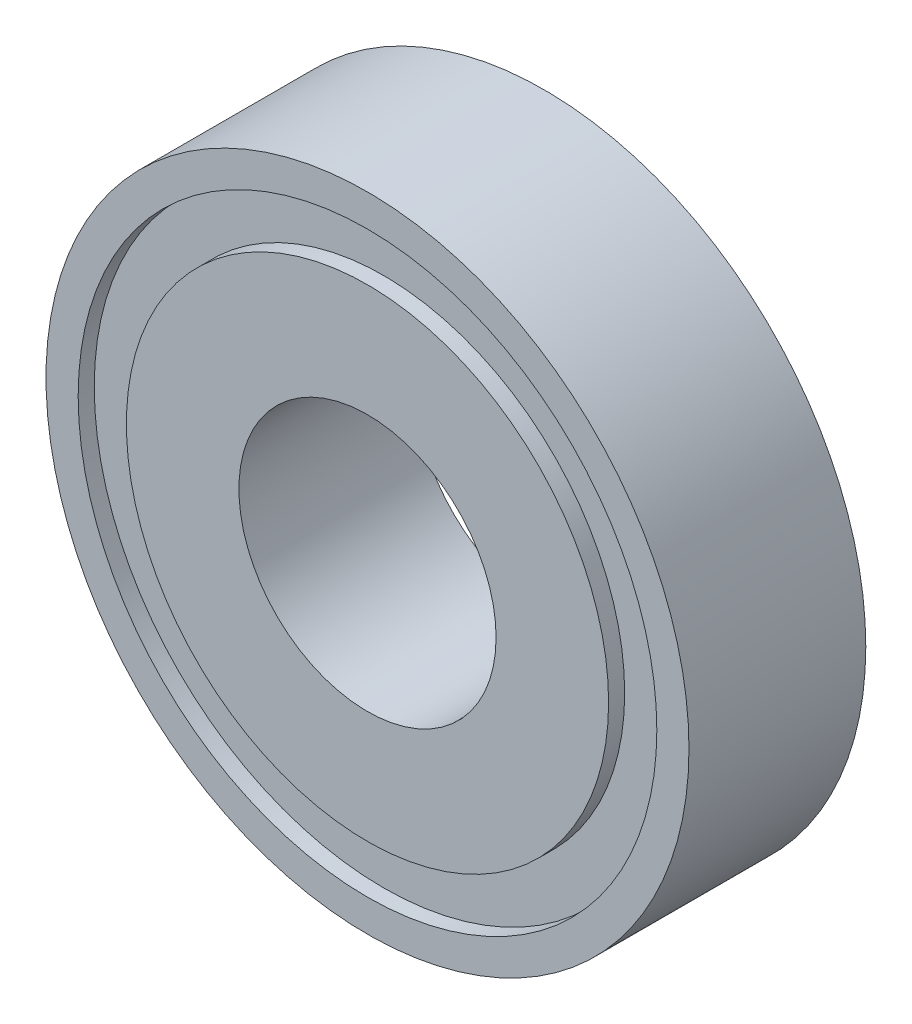
ISO-10303-21;
HEADER;
FILE_DESCRIPTION(('STEP AP214'),'2;1');
FILE_NAME('part.step','',(''),(''),'','','');
FILE_SCHEMA(('AUTOMOTIVE_DESIGN { 1 0 10303 214 1 1 1 1 }'));
ENDSEC;
DATA;
#1=APPLICATION_CONTEXT('core data for automotive mechanical design processes');
#2=APPLICATION_PROTOCOL_DEFINITION('international standard','automotive_design',2000,#1);
#3=PRODUCT_CONTEXT('',#1,'mechanical');
#4=PRODUCT('Part','Part','',(#3));
#5=PRODUCT_RELATED_PRODUCT_CATEGORY('part','',(#4));
#6=PRODUCT_DEFINITION_FORMATION('','',#4);
#7=PRODUCT_DEFINITION_CONTEXT('part definition',#1,'design');
#8=PRODUCT_DEFINITION('design','',#6,#7);
#9=PRODUCT_DEFINITION_SHAPE('','',#8);
#10=(LENGTH_UNIT() NAMED_UNIT(*) SI_UNIT(.MILLI.,.METRE.));
#11=(NAMED_UNIT(*) PLANE_ANGLE_UNIT() SI_UNIT($,.RADIAN.));
#12=(NAMED_UNIT(*) SI_UNIT($,.STERADIAN.) SOLID_ANGLE_UNIT());
#13=UNCERTAINTY_MEASURE_WITH_UNIT(LENGTH_MEASURE(1.E-05),#10,'distance_accuracy_value','');
#14=(GEOMETRIC_REPRESENTATION_CONTEXT(3) GLOBAL_UNCERTAINTY_ASSIGNED_CONTEXT((#13)) GLOBAL_UNIT_ASSIGNED_CONTEXT((#10,
#11,#12)) REPRESENTATION_CONTEXT('',''));
#15=CARTESIAN_POINT('',(0.,0.,0.));
#16=DIRECTION('',(0.,0.,1.));
#17=DIRECTION('',(1.,0.,0.));
#18=AXIS2_PLACEMENT_3D('',#15,#16,#17);
#19=CARTESIAN_POINT('',(0.,0.,11.));
#20=DIRECTION('',(0.,0.,1.));
#21=DIRECTION('',(1.,0.,0.));
#22=AXIS2_PLACEMENT_3D('',#19,#20,#21);
#23=PLANE('',#22);
#24=CARTESIAN_POINT('',(0.,0.,11.));
#25=DIRECTION('',(0.,0.,1.));
#26=DIRECTION('',(1.,0.,0.));
#27=AXIS2_PLACEMENT_3D('',#24,#25,#26);
#28=CIRCLE('',#27,8.);
#29=CARTESIAN_POINT('',(8.,0.,11.));
#30=VERTEX_POINT('',#29);
#31=EDGE_CURVE('E44',#30,#30,#28,.T.);
#32=ORIENTED_EDGE('',*,*,#31,.F.);
#33=EDGE_LOOP('',(#32));
#34=FACE_BOUND('',#33,.T.);
#35=CARTESIAN_POINT('',(0.,0.,11.));
#36=DIRECTION('',(0.,0.,1.));
#37=DIRECTION('',(1.,0.,0.));
#38=AXIS2_PLACEMENT_3D('',#35,#36,#37);
#39=CIRCLE('',#38,15.);
#40=CARTESIAN_POINT('',(15.,0.,11.));
#41=VERTEX_POINT('',#40);
#42=EDGE_CURVE('E58',#41,#41,#39,.T.);
#43=ORIENTED_EDGE('',*,*,#42,.T.);
#44=EDGE_LOOP('',(#43));
#45=FACE_BOUND('',#44,.T.);
#46=ADVANCED_FACE('F33',(#34,#45),#23,.T.);
#47=CARTESIAN_POINT('',(0.,0.,11.));
#48=DIRECTION('',(0.,0.,1.));
#49=DIRECTION('',(1.,0.,0.));
#50=AXIS2_PLACEMENT_3D('',#47,#48,#49);
#51=CIRCLE('',#50,18.);
#52=CARTESIAN_POINT('',(18.,0.,11.));
#53=VERTEX_POINT('',#52);
#54=EDGE_CURVE('E52',#53,#53,#51,.T.);
#55=ORIENTED_EDGE('',*,*,#54,.F.);
#56=EDGE_LOOP('',(#55));
#57=FACE_BOUND('',#56,.T.);
#58=CARTESIAN_POINT('',(0.,0.,11.));
#59=DIRECTION('',(0.,0.,1.));
#60=DIRECTION('',(1.,0.,0.));
#61=AXIS2_PLACEMENT_3D('',#58,#59,#60);
#62=CIRCLE('',#61,20.);
#63=CARTESIAN_POINT('',(20.,0.,11.));
#64=VERTEX_POINT('',#63);
#65=EDGE_CURVE('E10',#64,#64,#62,.T.);
#66=ORIENTED_EDGE('',*,*,#65,.T.);
#67=EDGE_LOOP('',(#66));
#68=FACE_BOUND('',#67,.T.);
#69=ADVANCED_FACE('F80',(#57,#68),#23,.T.);
#70=CARTESIAN_POINT('',(0.,0.,0.));
#71=DIRECTION('',(0.,0.,1.));
#72=DIRECTION('',(1.,0.,0.));
#73=AXIS2_PLACEMENT_3D('',#70,#71,#72);
#74=PLANE('',#73);
#75=CARTESIAN_POINT('',(0.,0.,0.));
#76=DIRECTION('',(0.,0.,1.));
#77=DIRECTION('',(1.,0.,0.));
#78=AXIS2_PLACEMENT_3D('',#75,#76,#77);
#79=CIRCLE('',#78,20.);
#80=CARTESIAN_POINT('',(20.,0.,0.));
#81=VERTEX_POINT('',#80);
#82=EDGE_CURVE('E37',#81,#81,#79,.T.);
#83=ORIENTED_EDGE('',*,*,#82,.F.);
#84=EDGE_LOOP('',(#83));
#85=FACE_BOUND('',#84,.T.);
#86=CARTESIAN_POINT('',(0.,0.,0.));
#87=DIRECTION('',(0.,0.,1.));
#88=DIRECTION('',(1.,0.,0.));
#89=AXIS2_PLACEMENT_3D('',#86,#87,#88);
#90=CIRCLE('',#89,8.);
#91=CARTESIAN_POINT('',(8.,0.,0.));
#92=VERTEX_POINT('',#91);
#93=EDGE_CURVE('E46',#92,#92,#90,.T.);
#94=ORIENTED_EDGE('',*,*,#93,.T.);
#95=EDGE_LOOP('',(#94));
#96=FACE_BOUND('',#95,.T.);
#97=ADVANCED_FACE('F82',(#85,#96),#74,.F.);
#98=CARTESIAN_POINT('',(0.,0.,11.));
#99=DIRECTION('',(0.,0.,-1.));
#100=DIRECTION('',(-1.,0.,0.));
#101=AXIS2_PLACEMENT_3D('',#98,#99,#100);
#102=CYLINDRICAL_SURFACE('',#101,20.);
#103=ORIENTED_EDGE('',*,*,#65,.F.);
#104=EDGE_LOOP('',(#103));
#105=FACE_BOUND('',#104,.T.);
#106=ORIENTED_EDGE('',*,*,#82,.T.);
#107=EDGE_LOOP('',(#106));
#108=FACE_BOUND('',#107,.T.);
#109=ADVANCED_FACE('F35',(#105,#108),#102,.T.);
#110=CARTESIAN_POINT('',(0.,0.,11.));
#111=DIRECTION('',(0.,0.,-1.));
#112=DIRECTION('',(-1.,0.,0.));
#113=AXIS2_PLACEMENT_3D('',#110,#111,#112);
#114=CYLINDRICAL_SURFACE('',#113,8.);
#115=ORIENTED_EDGE('',*,*,#31,.T.);
#116=EDGE_LOOP('',(#115));
#117=FACE_BOUND('',#116,.T.);
#118=ORIENTED_EDGE('',*,*,#93,.F.);
#119=EDGE_LOOP('',(#118));
#120=FACE_BOUND('',#119,.T.);
#121=ADVANCED_FACE('F76',(#117,#120),#114,.F.);
#122=CARTESIAN_POINT('',(0.,0.,10.));
#123=DIRECTION('',(0.,0.,1.));
#124=DIRECTION('',(1.,0.,0.));
#125=AXIS2_PLACEMENT_3D('',#122,#123,#124);
#126=CYLINDRICAL_SURFACE('',#125,18.);
#127=CARTESIAN_POINT('',(0.,0.,10.));
#128=DIRECTION('',(0.,0.,1.));
#129=DIRECTION('',(1.,0.,0.));
#130=AXIS2_PLACEMENT_3D('',#127,#128,#129);
#131=CIRCLE('',#130,18.);
#132=CARTESIAN_POINT('',(18.,0.,10.));
#133=VERTEX_POINT('',#132);
#134=EDGE_CURVE('E49',#133,#133,#131,.T.);
#135=ORIENTED_EDGE('',*,*,#134,.F.);
#136=EDGE_LOOP('',(#135));
#137=FACE_BOUND('',#136,.T.);
#138=ORIENTED_EDGE('',*,*,#54,.T.);
#139=EDGE_LOOP('',(#138));
#140=FACE_BOUND('',#139,.T.);
#141=ADVANCED_FACE('F70',(#137,#140),#126,.F.);
#142=CARTESIAN_POINT('',(0.,0.,10.));
#143=DIRECTION('',(0.,0.,1.));
#144=DIRECTION('',(1.,0.,0.));
#145=AXIS2_PLACEMENT_3D('',#142,#143,#144);
#146=PLANE('',#145);
#147=CARTESIAN_POINT('',(0.,0.,10.));
#148=DIRECTION('',(0.,0.,1.));
#149=DIRECTION('',(1.,0.,0.));
#150=AXIS2_PLACEMENT_3D('',#147,#148,#149);
#151=CIRCLE('',#150,15.);
#152=CARTESIAN_POINT('',(15.,0.,10.));
#153=VERTEX_POINT('',#152);
#154=EDGE_CURVE('E55',#153,#153,#151,.T.);
#155=ORIENTED_EDGE('',*,*,#154,.F.);
#156=EDGE_LOOP('',(#155));
#157=FACE_BOUND('',#156,.T.);
#158=ORIENTED_EDGE('',*,*,#134,.T.);
#159=EDGE_LOOP('',(#158));
#160=FACE_BOUND('',#159,.T.);
#161=ADVANCED_FACE('F67',(#157,#160),#146,.T.);
#162=CARTESIAN_POINT('',(0.,0.,10.));
#163=DIRECTION('',(0.,0.,1.));
#164=DIRECTION('',(1.,0.,0.));
#165=AXIS2_PLACEMENT_3D('',#162,#163,#164);
#166=CYLINDRICAL_SURFACE('',#165,15.);
#167=ORIENTED_EDGE('',*,*,#154,.T.);
#168=EDGE_LOOP('',(#167));
#169=FACE_BOUND('',#168,.T.);
#170=ORIENTED_EDGE('',*,*,#42,.F.);
#171=EDGE_LOOP('',(#170));
#172=FACE_BOUND('',#171,.T.);
#173=ADVANCED_FACE('F64',(#169,#172),#166,.T.);
#174=CLOSED_SHELL('',(#46,#69,#97,#109,#121,#141,#161,#173));
#175=MANIFOLD_SOLID_BREP('B2',#174);
#176=ADVANCED_BREP_SHAPE_REPRESENTATION('',(#18,#175),#14);
#177=SHAPE_DEFINITION_REPRESENTATION(#9,#176);
ENDSEC;
END-ISO-10303-21;
